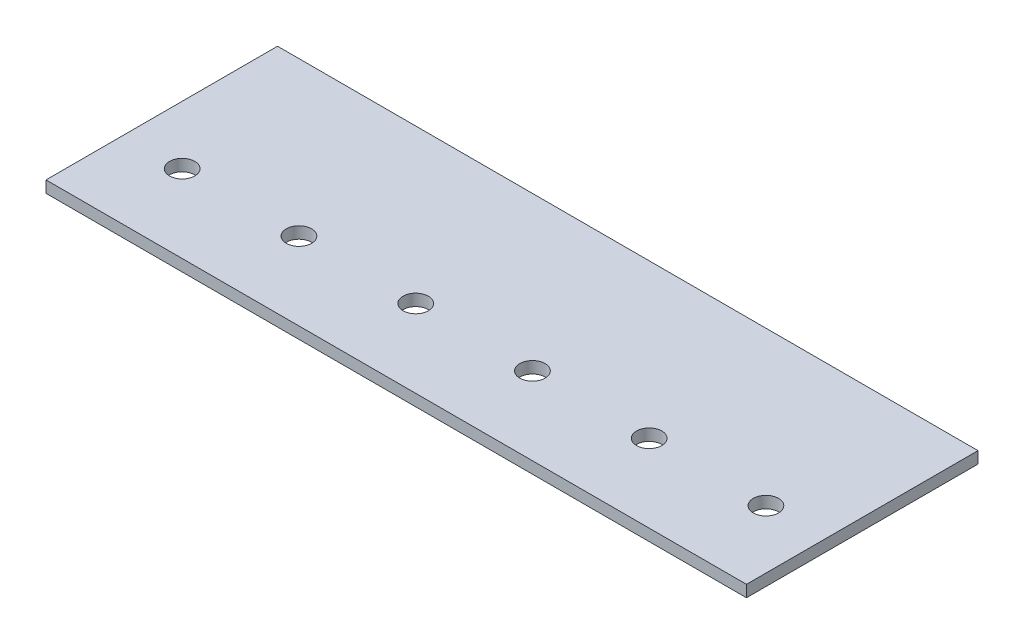
ISO-10303-21;
HEADER;
FILE_DESCRIPTION(('STEP AP214'),'2;1');
FILE_NAME('part.step','',(''),(''),'','','');
FILE_SCHEMA(('AUTOMOTIVE_DESIGN { 1 0 10303 214 1 1 1 1 }'));
ENDSEC;
DATA;
#1=APPLICATION_CONTEXT('core data for automotive mechanical design processes');
#2=APPLICATION_PROTOCOL_DEFINITION('international standard','automotive_design',2000,#1);
#3=PRODUCT_CONTEXT('',#1,'mechanical');
#4=PRODUCT('Part','Part','',(#3));
#5=PRODUCT_RELATED_PRODUCT_CATEGORY('part','',(#4));
#6=PRODUCT_DEFINITION_FORMATION('','',#4);
#7=PRODUCT_DEFINITION_CONTEXT('part definition',#1,'design');
#8=PRODUCT_DEFINITION('design','',#6,#7);
#9=PRODUCT_DEFINITION_SHAPE('','',#8);
#10=(LENGTH_UNIT() NAMED_UNIT(*) SI_UNIT(.MILLI.,.METRE.));
#11=(NAMED_UNIT(*) PLANE_ANGLE_UNIT() SI_UNIT($,.RADIAN.));
#12=(NAMED_UNIT(*) SI_UNIT($,.STERADIAN.) SOLID_ANGLE_UNIT());
#13=UNCERTAINTY_MEASURE_WITH_UNIT(LENGTH_MEASURE(1.E-05),#10,'distance_accuracy_value','');
#14=(GEOMETRIC_REPRESENTATION_CONTEXT(3) GLOBAL_UNCERTAINTY_ASSIGNED_CONTEXT((#13)) GLOBAL_UNIT_ASSIGNED_CONTEXT((#10,
#11,#12)) REPRESENTATION_CONTEXT('',''));
#15=CARTESIAN_POINT('',(0.,0.,0.));
#16=DIRECTION('',(0.,0.,1.));
#17=DIRECTION('',(1.,0.,0.));
#18=AXIS2_PLACEMENT_3D('',#15,#16,#17);
#19=CARTESIAN_POINT('',(90.,3.,29.75));
#20=DIRECTION('',(-1.,0.,0.));
#21=DIRECTION('',(0.,0.,1.));
#22=AXIS2_PLACEMENT_3D('',#19,#20,#21);
#23=PLANE('',#22);
#24=DIRECTION('',(0.,0.,-1.));
#25=VECTOR('',#24,1.);
#26=CARTESIAN_POINT('',(90.,0.,29.75));
#27=LINE('',#26,#25);
#28=CARTESIAN_POINT('',(90.,0.,29.75));
#29=VERTEX_POINT('',#28);
#30=CARTESIAN_POINT('',(90.,0.,-29.75));
#31=VERTEX_POINT('',#30);
#32=EDGE_CURVE('E107',#29,#31,#27,.T.);
#33=ORIENTED_EDGE('',*,*,#32,.T.);
#34=DIRECTION('',(0.,-1.,0.));
#35=VECTOR('',#34,1.);
#36=CARTESIAN_POINT('',(90.,3.,-29.75));
#37=LINE('',#36,#35);
#38=CARTESIAN_POINT('',(90.,3.,-29.75));
#39=VERTEX_POINT('',#38);
#40=EDGE_CURVE('E11',#39,#31,#37,.T.);
#41=ORIENTED_EDGE('',*,*,#40,.F.);
#42=DIRECTION('',(0.,0.,-1.));
#43=VECTOR('',#42,1.);
#44=CARTESIAN_POINT('',(90.,3.,29.75));
#45=LINE('',#44,#43);
#46=CARTESIAN_POINT('',(90.,3.,29.75));
#47=VERTEX_POINT('',#46);
#48=EDGE_CURVE('E91',#47,#39,#45,.T.);
#49=ORIENTED_EDGE('',*,*,#48,.F.);
#50=DIRECTION('',(0.,-1.,0.));
#51=VECTOR('',#50,1.);
#52=CARTESIAN_POINT('',(90.,3.,29.75));
#53=LINE('',#52,#51);
#54=EDGE_CURVE('E103',#47,#29,#53,.T.);
#55=ORIENTED_EDGE('',*,*,#54,.T.);
#56=EDGE_LOOP('',(#33,#41,#49,#55));
#57=FACE_BOUND('',#56,.T.);
#58=ADVANCED_FACE('F39',(#57),#23,.F.);
#59=CARTESIAN_POINT('',(-90.,3.,-29.75));
#60=DIRECTION('',(0.,0.,1.));
#61=DIRECTION('',(1.,0.,0.));
#62=AXIS2_PLACEMENT_3D('',#59,#60,#61);
#63=PLANE('',#62);
#64=DIRECTION('',(-1.,0.,0.));
#65=VECTOR('',#64,1.);
#66=CARTESIAN_POINT('',(-90.,0.,-29.75));
#67=LINE('',#66,#65);
#68=CARTESIAN_POINT('',(-90.,0.,-29.75));
#69=VERTEX_POINT('',#68);
#70=EDGE_CURVE('E96',#31,#69,#67,.T.);
#71=ORIENTED_EDGE('',*,*,#70,.T.);
#72=DIRECTION('',(0.,-1.,0.));
#73=VECTOR('',#72,1.);
#74=CARTESIAN_POINT('',(-90.,3.,-29.75));
#75=LINE('',#74,#73);
#76=CARTESIAN_POINT('',(-90.,3.,-29.75));
#77=VERTEX_POINT('',#76);
#78=EDGE_CURVE('E48',#77,#69,#75,.T.);
#79=ORIENTED_EDGE('',*,*,#78,.F.);
#80=DIRECTION('',(-1.,0.,0.));
#81=VECTOR('',#80,1.);
#82=CARTESIAN_POINT('',(-90.,3.,-29.75));
#83=LINE('',#82,#81);
#84=EDGE_CURVE('E86',#39,#77,#83,.T.);
#85=ORIENTED_EDGE('',*,*,#84,.F.);
#86=ORIENTED_EDGE('',*,*,#40,.T.);
#87=EDGE_LOOP('',(#71,#79,#85,#86));
#88=FACE_BOUND('',#87,.T.);
#89=ADVANCED_FACE('F95',(#88),#63,.F.);
#90=CARTESIAN_POINT('',(-90.,3.,29.75));
#91=DIRECTION('',(1.,0.,0.));
#92=DIRECTION('',(0.,0.,-1.));
#93=AXIS2_PLACEMENT_3D('',#90,#91,#92);
#94=PLANE('',#93);
#95=DIRECTION('',(0.,0.,1.));
#96=VECTOR('',#95,1.);
#97=CARTESIAN_POINT('',(-90.,0.,29.75));
#98=LINE('',#97,#96);
#99=CARTESIAN_POINT('',(-90.,0.,29.75));
#100=VERTEX_POINT('',#99);
#101=EDGE_CURVE('E73',#69,#100,#98,.T.);
#102=ORIENTED_EDGE('',*,*,#101,.T.);
#103=DIRECTION('',(0.,-1.,0.));
#104=VECTOR('',#103,1.);
#105=CARTESIAN_POINT('',(-90.,3.,29.75));
#106=LINE('',#105,#104);
#107=CARTESIAN_POINT('',(-90.,3.,29.75));
#108=VERTEX_POINT('',#107);
#109=EDGE_CURVE('E98',#108,#100,#106,.T.);
#110=ORIENTED_EDGE('',*,*,#109,.F.);
#111=DIRECTION('',(0.,0.,1.));
#112=VECTOR('',#111,1.);
#113=CARTESIAN_POINT('',(-90.,3.,29.75));
#114=LINE('',#113,#112);
#115=EDGE_CURVE('E89',#77,#108,#114,.T.);
#116=ORIENTED_EDGE('',*,*,#115,.F.);
#117=ORIENTED_EDGE('',*,*,#78,.T.);
#118=EDGE_LOOP('',(#102,#110,#116,#117));
#119=FACE_BOUND('',#118,.T.);
#120=ADVANCED_FACE('F99',(#119),#94,.F.);
#121=CARTESIAN_POINT('',(-90.,3.,29.75));
#122=DIRECTION('',(0.,0.,-1.));
#123=DIRECTION('',(-1.,0.,0.));
#124=AXIS2_PLACEMENT_3D('',#121,#122,#123);
#125=PLANE('',#124);
#126=DIRECTION('',(1.,0.,0.));
#127=VECTOR('',#126,1.);
#128=CARTESIAN_POINT('',(-90.,0.,29.75));
#129=LINE('',#128,#127);
#130=EDGE_CURVE('E79',#100,#29,#129,.T.);
#131=ORIENTED_EDGE('',*,*,#130,.T.);
#132=ORIENTED_EDGE('',*,*,#54,.F.);
#133=DIRECTION('',(1.,0.,0.));
#134=VECTOR('',#133,1.);
#135=CARTESIAN_POINT('',(-90.,3.,29.75));
#136=LINE('',#135,#134);
#137=EDGE_CURVE('E56',#108,#47,#136,.T.);
#138=ORIENTED_EDGE('',*,*,#137,.F.);
#139=ORIENTED_EDGE('',*,*,#109,.T.);
#140=EDGE_LOOP('',(#131,#132,#138,#139));
#141=FACE_BOUND('',#140,.T.);
#142=ADVANCED_FACE('F121',(#141),#125,.F.);
#143=CARTESIAN_POINT('',(0.,3.,0.));
#144=DIRECTION('',(0.,-1.,0.));
#145=DIRECTION('',(0.,0.,-1.));
#146=AXIS2_PLACEMENT_3D('',#143,#144,#145);
#147=PLANE('',#146);
#148=CARTESIAN_POINT('',(-75.,3.,9.75000000000001));
#149=DIRECTION('',(0.,1.,0.));
#150=DIRECTION('',(0.,0.,1.));
#151=AXIS2_PLACEMENT_3D('',#148,#149,#150);
#152=CIRCLE('',#151,3.25000000000001);
#153=CARTESIAN_POINT('',(-75.,3.,13.));
#154=VERTEX_POINT('',#153);
#155=EDGE_CURVE('E168',#154,#154,#152,.T.);
#156=ORIENTED_EDGE('',*,*,#155,.F.);
#157=EDGE_LOOP('',(#156));
#158=FACE_BOUND('',#157,.T.);
#159=CARTESIAN_POINT('',(-45.,3.,9.75000000000001));
#160=DIRECTION('',(0.,1.,0.));
#161=DIRECTION('',(0.,0.,1.));
#162=AXIS2_PLACEMENT_3D('',#159,#160,#161);
#163=CIRCLE('',#162,3.25);
#164=CARTESIAN_POINT('',(-45.,3.,13.));
#165=VERTEX_POINT('',#164);
#166=EDGE_CURVE('E160',#165,#165,#163,.T.);
#167=ORIENTED_EDGE('',*,*,#166,.F.);
#168=EDGE_LOOP('',(#167));
#169=FACE_BOUND('',#168,.T.);
#170=CARTESIAN_POINT('',(-15.,3.,9.75000000000001));
#171=DIRECTION('',(0.,1.,0.));
#172=DIRECTION('',(0.,0.,1.));
#173=AXIS2_PLACEMENT_3D('',#170,#171,#172);
#174=CIRCLE('',#173,3.25);
#175=CARTESIAN_POINT('',(-15.,3.,13.));
#176=VERTEX_POINT('',#175);
#177=EDGE_CURVE('E152',#176,#176,#174,.T.);
#178=ORIENTED_EDGE('',*,*,#177,.F.);
#179=EDGE_LOOP('',(#178));
#180=FACE_BOUND('',#179,.T.);
#181=CARTESIAN_POINT('',(15.,3.,9.75000000000001));
#182=DIRECTION('',(0.,1.,0.));
#183=DIRECTION('',(0.,0.,1.));
#184=AXIS2_PLACEMENT_3D('',#181,#182,#183);
#185=CIRCLE('',#184,3.25);
#186=CARTESIAN_POINT('',(15.,3.,13.));
#187=VERTEX_POINT('',#186);
#188=EDGE_CURVE('E144',#187,#187,#185,.T.);
#189=ORIENTED_EDGE('',*,*,#188,.F.);
#190=EDGE_LOOP('',(#189));
#191=FACE_BOUND('',#190,.T.);
#192=CARTESIAN_POINT('',(45.,3.,9.75000000000001));
#193=DIRECTION('',(0.,1.,0.));
#194=DIRECTION('',(0.,0.,1.));
#195=AXIS2_PLACEMENT_3D('',#192,#193,#194);
#196=CIRCLE('',#195,3.25);
#197=CARTESIAN_POINT('',(45.,3.,13.));
#198=VERTEX_POINT('',#197);
#199=EDGE_CURVE('E136',#198,#198,#196,.T.);
#200=ORIENTED_EDGE('',*,*,#199,.F.);
#201=EDGE_LOOP('',(#200));
#202=FACE_BOUND('',#201,.T.);
#203=CARTESIAN_POINT('',(75.,3.,9.75000000000001));
#204=DIRECTION('',(0.,1.,0.));
#205=DIRECTION('',(0.,0.,1.));
#206=AXIS2_PLACEMENT_3D('',#203,#204,#205);
#207=CIRCLE('',#206,3.25000000000001);
#208=CARTESIAN_POINT('',(75.,3.,13.));
#209=VERTEX_POINT('',#208);
#210=EDGE_CURVE('E128',#209,#209,#207,.T.);
#211=ORIENTED_EDGE('',*,*,#210,.F.);
#212=EDGE_LOOP('',(#211));
#213=FACE_BOUND('',#212,.T.);
#214=ORIENTED_EDGE('',*,*,#48,.T.);
#215=ORIENTED_EDGE('',*,*,#84,.T.);
#216=ORIENTED_EDGE('',*,*,#115,.T.);
#217=ORIENTED_EDGE('',*,*,#137,.T.);
#218=EDGE_LOOP('',(#214,#215,#216,#217));
#219=FACE_BOUND('',#218,.T.);
#220=ADVANCED_FACE('F87',(#158,#169,#180,#191,#202,#213,#219),#147,.F.);
#221=CARTESIAN_POINT('',(0.,0.,0.));
#222=DIRECTION('',(0.,-1.,0.));
#223=DIRECTION('',(0.,0.,-1.));
#224=AXIS2_PLACEMENT_3D('',#221,#222,#223);
#225=PLANE('',#224);
#226=CARTESIAN_POINT('',(-75.,0.,9.75000000000001));
#227=DIRECTION('',(0.,1.,0.));
#228=DIRECTION('',(0.,0.,1.));
#229=AXIS2_PLACEMENT_3D('',#226,#227,#228);
#230=CIRCLE('',#229,3.25000000000001);
#231=CARTESIAN_POINT('',(-75.,0.,13.));
#232=VERTEX_POINT('',#231);
#233=EDGE_CURVE('E111',#232,#232,#230,.T.);
#234=ORIENTED_EDGE('',*,*,#233,.T.);
#235=EDGE_LOOP('',(#234));
#236=FACE_BOUND('',#235,.T.);
#237=CARTESIAN_POINT('',(-45.,0.,9.75000000000001));
#238=DIRECTION('',(0.,1.,0.));
#239=DIRECTION('',(0.,0.,1.));
#240=AXIS2_PLACEMENT_3D('',#237,#238,#239);
#241=CIRCLE('',#240,3.25);
#242=CARTESIAN_POINT('',(-45.,0.,13.));
#243=VERTEX_POINT('',#242);
#244=EDGE_CURVE('E164',#243,#243,#241,.T.);
#245=ORIENTED_EDGE('',*,*,#244,.T.);
#246=EDGE_LOOP('',(#245));
#247=FACE_BOUND('',#246,.T.);
#248=CARTESIAN_POINT('',(-15.,0.,9.75000000000001));
#249=DIRECTION('',(0.,1.,0.));
#250=DIRECTION('',(0.,0.,1.));
#251=AXIS2_PLACEMENT_3D('',#248,#249,#250);
#252=CIRCLE('',#251,3.25);
#253=CARTESIAN_POINT('',(-15.,0.,13.));
#254=VERTEX_POINT('',#253);
#255=EDGE_CURVE('E156',#254,#254,#252,.T.);
#256=ORIENTED_EDGE('',*,*,#255,.T.);
#257=EDGE_LOOP('',(#256));
#258=FACE_BOUND('',#257,.T.);
#259=CARTESIAN_POINT('',(15.,0.,9.75000000000001));
#260=DIRECTION('',(0.,1.,0.));
#261=DIRECTION('',(0.,0.,1.));
#262=AXIS2_PLACEMENT_3D('',#259,#260,#261);
#263=CIRCLE('',#262,3.25);
#264=CARTESIAN_POINT('',(15.,0.,13.));
#265=VERTEX_POINT('',#264);
#266=EDGE_CURVE('E148',#265,#265,#263,.T.);
#267=ORIENTED_EDGE('',*,*,#266,.T.);
#268=EDGE_LOOP('',(#267));
#269=FACE_BOUND('',#268,.T.);
#270=CARTESIAN_POINT('',(45.,0.,9.75000000000001));
#271=DIRECTION('',(0.,1.,0.));
#272=DIRECTION('',(0.,0.,1.));
#273=AXIS2_PLACEMENT_3D('',#270,#271,#272);
#274=CIRCLE('',#273,3.25);
#275=CARTESIAN_POINT('',(45.,0.,13.));
#276=VERTEX_POINT('',#275);
#277=EDGE_CURVE('E140',#276,#276,#274,.T.);
#278=ORIENTED_EDGE('',*,*,#277,.T.);
#279=EDGE_LOOP('',(#278));
#280=FACE_BOUND('',#279,.T.);
#281=CARTESIAN_POINT('',(75.,0.,9.75000000000001));
#282=DIRECTION('',(0.,1.,0.));
#283=DIRECTION('',(0.,0.,1.));
#284=AXIS2_PLACEMENT_3D('',#281,#282,#283);
#285=CIRCLE('',#284,3.25000000000001);
#286=CARTESIAN_POINT('',(75.,0.,13.));
#287=VERTEX_POINT('',#286);
#288=EDGE_CURVE('E132',#287,#287,#285,.T.);
#289=ORIENTED_EDGE('',*,*,#288,.T.);
#290=EDGE_LOOP('',(#289));
#291=FACE_BOUND('',#290,.T.);
#292=ORIENTED_EDGE('',*,*,#32,.F.);
#293=ORIENTED_EDGE('',*,*,#130,.F.);
#294=ORIENTED_EDGE('',*,*,#101,.F.);
#295=ORIENTED_EDGE('',*,*,#70,.F.);
#296=EDGE_LOOP('',(#292,#293,#294,#295));
#297=FACE_BOUND('',#296,.T.);
#298=ADVANCED_FACE('F124',(#236,#247,#258,#269,#280,#291,#297),#225,.T.);
#299=CARTESIAN_POINT('',(75.,0.,9.75000000000001));
#300=DIRECTION('',(0.,1.,0.));
#301=DIRECTION('',(0.,0.,1.));
#302=AXIS2_PLACEMENT_3D('',#299,#300,#301);
#303=CYLINDRICAL_SURFACE('',#302,3.25000000000001);
#304=ORIENTED_EDGE('',*,*,#288,.F.);
#305=EDGE_LOOP('',(#304));
#306=FACE_BOUND('',#305,.T.);
#307=ORIENTED_EDGE('',*,*,#210,.T.);
#308=EDGE_LOOP('',(#307));
#309=FACE_BOUND('',#308,.T.);
#310=ADVANCED_FACE('F198',(#306,#309),#303,.F.);
#311=CARTESIAN_POINT('',(45.,0.,9.75000000000001));
#312=DIRECTION('',(0.,1.,0.));
#313=DIRECTION('',(0.,0.,1.));
#314=AXIS2_PLACEMENT_3D('',#311,#312,#313);
#315=CYLINDRICAL_SURFACE('',#314,3.25);
#316=ORIENTED_EDGE('',*,*,#277,.F.);
#317=EDGE_LOOP('',(#316));
#318=FACE_BOUND('',#317,.T.);
#319=ORIENTED_EDGE('',*,*,#199,.T.);
#320=EDGE_LOOP('',(#319));
#321=FACE_BOUND('',#320,.T.);
#322=ADVANCED_FACE('F200',(#318,#321),#315,.F.);
#323=CARTESIAN_POINT('',(15.,0.,9.75000000000001));
#324=DIRECTION('',(0.,1.,0.));
#325=DIRECTION('',(0.,0.,1.));
#326=AXIS2_PLACEMENT_3D('',#323,#324,#325);
#327=CYLINDRICAL_SURFACE('',#326,3.25);
#328=ORIENTED_EDGE('',*,*,#266,.F.);
#329=EDGE_LOOP('',(#328));
#330=FACE_BOUND('',#329,.T.);
#331=ORIENTED_EDGE('',*,*,#188,.T.);
#332=EDGE_LOOP('',(#331));
#333=FACE_BOUND('',#332,.T.);
#334=ADVANCED_FACE('F207',(#330,#333),#327,.F.);
#335=CARTESIAN_POINT('',(-15.,0.,9.75000000000001));
#336=DIRECTION('',(0.,1.,0.));
#337=DIRECTION('',(0.,0.,1.));
#338=AXIS2_PLACEMENT_3D('',#335,#336,#337);
#339=CYLINDRICAL_SURFACE('',#338,3.25);
#340=ORIENTED_EDGE('',*,*,#255,.F.);
#341=EDGE_LOOP('',(#340));
#342=FACE_BOUND('',#341,.T.);
#343=ORIENTED_EDGE('',*,*,#177,.T.);
#344=EDGE_LOOP('',(#343));
#345=FACE_BOUND('',#344,.T.);
#346=ADVANCED_FACE('F253',(#342,#345),#339,.F.);
#347=CARTESIAN_POINT('',(-45.,0.,9.75000000000001));
#348=DIRECTION('',(0.,1.,0.));
#349=DIRECTION('',(0.,0.,1.));
#350=AXIS2_PLACEMENT_3D('',#347,#348,#349);
#351=CYLINDRICAL_SURFACE('',#350,3.25);
#352=ORIENTED_EDGE('',*,*,#244,.F.);
#353=EDGE_LOOP('',(#352));
#354=FACE_BOUND('',#353,.T.);
#355=ORIENTED_EDGE('',*,*,#166,.T.);
#356=EDGE_LOOP('',(#355));
#357=FACE_BOUND('',#356,.T.);
#358=ADVANCED_FACE('F181',(#354,#357),#351,.F.);
#359=CARTESIAN_POINT('',(-75.,0.,9.75000000000001));
#360=DIRECTION('',(0.,1.,0.));
#361=DIRECTION('',(0.,0.,1.));
#362=AXIS2_PLACEMENT_3D('',#359,#360,#361);
#363=CYLINDRICAL_SURFACE('',#362,3.25000000000001);
#364=ORIENTED_EDGE('',*,*,#233,.F.);
#365=EDGE_LOOP('',(#364));
#366=FACE_BOUND('',#365,.T.);
#367=ORIENTED_EDGE('',*,*,#155,.T.);
#368=EDGE_LOOP('',(#367));
#369=FACE_BOUND('',#368,.T.);
#370=ADVANCED_FACE('F178',(#366,#369),#363,.F.);
#371=CLOSED_SHELL('',(#58,#89,#120,#142,#220,#298,#310,#322,#334,#346,#358,#370));
#372=MANIFOLD_SOLID_BREP('B2',#371);
#373=ADVANCED_BREP_SHAPE_REPRESENTATION('',(#18,#372),#14);
#374=SHAPE_DEFINITION_REPRESENTATION(#9,#373);
ENDSEC;
END-ISO-10303-21;
